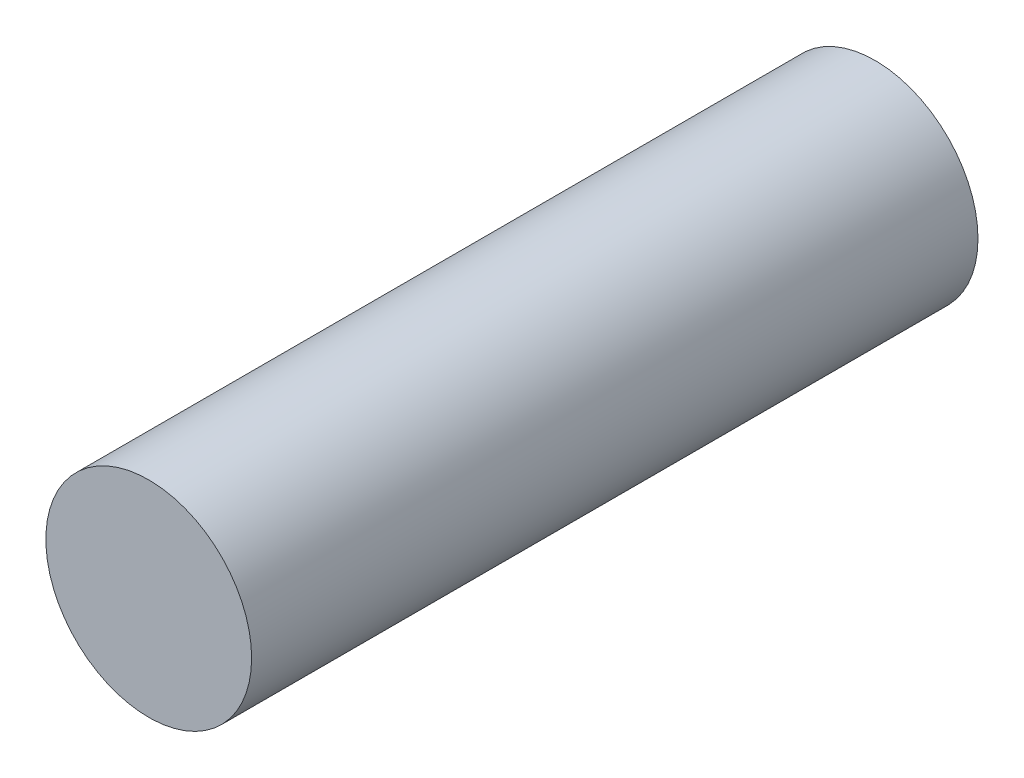
ISO-10303-21;
HEADER;
FILE_DESCRIPTION(('STEP AP214'),'2;1');
FILE_NAME('part.step','',(''),(''),'','','');
FILE_SCHEMA(('AUTOMOTIVE_DESIGN { 1 0 10303 214 1 1 1 1 }'));
ENDSEC;
DATA;
#1=APPLICATION_CONTEXT('core data for automotive mechanical design processes');
#2=APPLICATION_PROTOCOL_DEFINITION('international standard','automotive_design',2000,#1);
#3=PRODUCT_CONTEXT('',#1,'mechanical');
#4=PRODUCT('Part','Part','',(#3));
#5=PRODUCT_RELATED_PRODUCT_CATEGORY('part','',(#4));
#6=PRODUCT_DEFINITION_FORMATION('','',#4);
#7=PRODUCT_DEFINITION_CONTEXT('part definition',#1,'design');
#8=PRODUCT_DEFINITION('design','',#6,#7);
#9=PRODUCT_DEFINITION_SHAPE('','',#8);
#10=(LENGTH_UNIT() NAMED_UNIT(*) SI_UNIT(.MILLI.,.METRE.));
#11=(NAMED_UNIT(*) PLANE_ANGLE_UNIT() SI_UNIT($,.RADIAN.));
#12=(NAMED_UNIT(*) SI_UNIT($,.STERADIAN.) SOLID_ANGLE_UNIT());
#13=UNCERTAINTY_MEASURE_WITH_UNIT(LENGTH_MEASURE(1.E-05),#10,'distance_accuracy_value','');
#14=(GEOMETRIC_REPRESENTATION_CONTEXT(3) GLOBAL_UNCERTAINTY_ASSIGNED_CONTEXT((#13)) GLOBAL_UNIT_ASSIGNED_CONTEXT((#10,
#11,#12)) REPRESENTATION_CONTEXT('',''));
#15=CARTESIAN_POINT('',(0.,0.,0.));
#16=DIRECTION('',(0.,0.,1.));
#17=DIRECTION('',(1.,0.,0.));
#18=AXIS2_PLACEMENT_3D('',#15,#16,#17);
#19=CARTESIAN_POINT('',(0.,0.,32.65));
#20=DIRECTION('',(0.,0.,-1.));
#21=DIRECTION('',(-1.,0.,0.));
#22=AXIS2_PLACEMENT_3D('',#19,#20,#21);
#23=CYLINDRICAL_SURFACE('',#22,9.25000004199999);
#24=CARTESIAN_POINT('',(0.,0.,32.65));
#25=DIRECTION('',(0.,0.,1.));
#26=DIRECTION('',(1.,0.,0.));
#27=AXIS2_PLACEMENT_3D('',#24,#25,#26);
#28=CIRCLE('',#27,9.25000004199999);
#29=CARTESIAN_POINT('',(9.25000004199999,0.,32.65));
#30=VERTEX_POINT('',#29);
#31=EDGE_CURVE('E10',#30,#30,#28,.T.);
#32=ORIENTED_EDGE('',*,*,#31,.F.);
#33=EDGE_LOOP('',(#32));
#34=FACE_BOUND('',#33,.T.);
#35=CARTESIAN_POINT('',(0.,0.,-32.65));
#36=DIRECTION('',(0.,0.,1.));
#37=DIRECTION('',(1.,0.,0.));
#38=AXIS2_PLACEMENT_3D('',#35,#36,#37);
#39=CIRCLE('',#38,9.25000004199999);
#40=CARTESIAN_POINT('',(9.25000004199999,0.,-32.65));
#41=VERTEX_POINT('',#40);
#42=EDGE_CURVE('E42',#41,#41,#39,.T.);
#43=ORIENTED_EDGE('',*,*,#42,.T.);
#44=EDGE_LOOP('',(#43));
#45=FACE_BOUND('',#44,.T.);
#46=ADVANCED_FACE('F39',(#34,#45),#23,.T.);
#47=CARTESIAN_POINT('',(0.,0.,32.65));
#48=DIRECTION('',(0.,0.,1.));
#49=DIRECTION('',(1.,0.,0.));
#50=AXIS2_PLACEMENT_3D('',#47,#48,#49);
#51=PLANE('',#50);
#52=ORIENTED_EDGE('',*,*,#31,.T.);
#53=EDGE_LOOP('',(#52));
#54=FACE_BOUND('',#53,.T.);
#55=ADVANCED_FACE('F54',(#54),#51,.T.);
#56=CARTESIAN_POINT('',(0.,0.,-32.65));
#57=DIRECTION('',(0.,0.,1.));
#58=DIRECTION('',(1.,0.,0.));
#59=AXIS2_PLACEMENT_3D('',#56,#57,#58);
#60=PLANE('',#59);
#61=ORIENTED_EDGE('',*,*,#42,.F.);
#62=EDGE_LOOP('',(#61));
#63=FACE_BOUND('',#62,.T.);
#64=ADVANCED_FACE('F52',(#63),#60,.F.);
#65=CLOSED_SHELL('',(#46,#55,#64));
#66=MANIFOLD_SOLID_BREP('B2',#65);
#67=ADVANCED_BREP_SHAPE_REPRESENTATION('',(#18,#66),#14);
#68=SHAPE_DEFINITION_REPRESENTATION(#9,#67);
ENDSEC;
END-ISO-10303-21;
